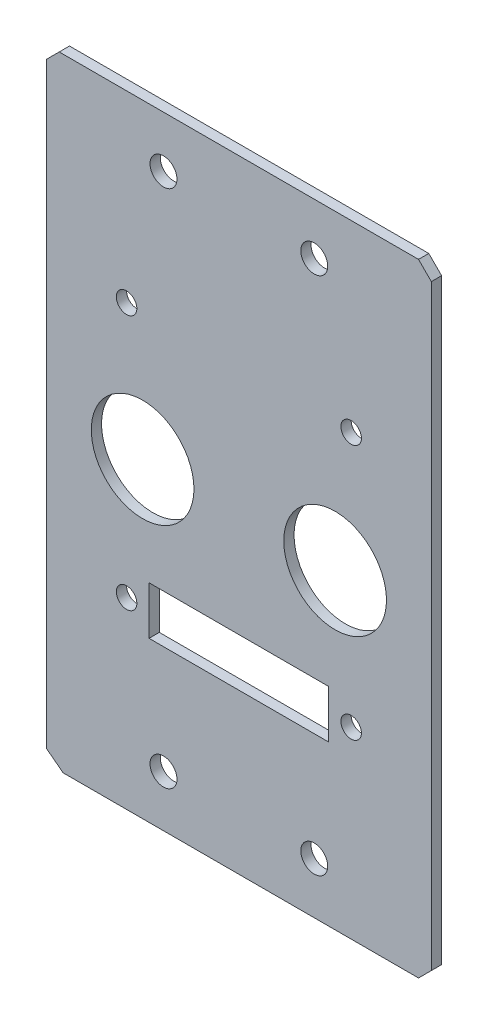
ISO-10303-21;
HEADER;
FILE_DESCRIPTION(('STEP AP214'),'2;1');
FILE_NAME('part.step','',(''),(''),'','','');
FILE_SCHEMA(('AUTOMOTIVE_DESIGN { 1 0 10303 214 1 1 1 1 }'));
ENDSEC;
DATA;
#1=APPLICATION_CONTEXT('core data for automotive mechanical design processes');
#2=APPLICATION_PROTOCOL_DEFINITION('international standard','automotive_design',2000,#1);
#3=PRODUCT_CONTEXT('',#1,'mechanical');
#4=PRODUCT('Part','Part','',(#3));
#5=PRODUCT_RELATED_PRODUCT_CATEGORY('part','',(#4));
#6=PRODUCT_DEFINITION_FORMATION('','',#4);
#7=PRODUCT_DEFINITION_CONTEXT('part definition',#1,'design');
#8=PRODUCT_DEFINITION('design','',#6,#7);
#9=PRODUCT_DEFINITION_SHAPE('','',#8);
#10=(LENGTH_UNIT() NAMED_UNIT(*) SI_UNIT(.MILLI.,.METRE.));
#11=(NAMED_UNIT(*) PLANE_ANGLE_UNIT() SI_UNIT($,.RADIAN.));
#12=(NAMED_UNIT(*) SI_UNIT($,.STERADIAN.) SOLID_ANGLE_UNIT());
#13=UNCERTAINTY_MEASURE_WITH_UNIT(LENGTH_MEASURE(1.E-05),#10,'distance_accuracy_value','');
#14=(GEOMETRIC_REPRESENTATION_CONTEXT(3) GLOBAL_UNCERTAINTY_ASSIGNED_CONTEXT((#13)) GLOBAL_UNIT_ASSIGNED_CONTEXT((#10,
#11,#12)) REPRESENTATION_CONTEXT('',''));
#15=CARTESIAN_POINT('',(0.,0.,0.));
#16=DIRECTION('',(0.,0.,1.));
#17=DIRECTION('',(1.,0.,0.));
#18=AXIS2_PLACEMENT_3D('',#15,#16,#17);
#19=CARTESIAN_POINT('',(1.07552855510562E-13,76.5000000000001,1.6));
#20=DIRECTION('',(0.,0.,-1.));
#21=DIRECTION('',(-1.,0.,0.));
#22=AXIS2_PLACEMENT_3D('',#19,#20,#21);
#23=PLANE('',#22);
#24=CARTESIAN_POINT('',(15.,0.,1.6));
#25=DIRECTION('',(0.,0.,1.));
#26=DIRECTION('',(-1.,0.,0.));
#27=AXIS2_PLACEMENT_3D('',#24,#25,#26);
#28=CIRCLE('',#27,8.);
#29=CARTESIAN_POINT('',(7.,0.,1.6));
#30=VERTEX_POINT('',#29);
#31=EDGE_CURVE('E158',#30,#30,#28,.T.);
#32=ORIENTED_EDGE('',*,*,#31,.F.);
#33=EDGE_LOOP('',(#32));
#34=FACE_BOUND('',#33,.T.);
#35=CARTESIAN_POINT('',(11.75,-40.5,1.6));
#36=DIRECTION('',(0.,0.,1.));
#37=DIRECTION('',(1.,0.,0.));
#38=AXIS2_PLACEMENT_3D('',#35,#36,#37);
#39=CIRCLE('',#38,2.1);
#40=CARTESIAN_POINT('',(13.85,-40.5,1.6));
#41=VERTEX_POINT('',#40);
#42=EDGE_CURVE('E170',#41,#41,#39,.T.);
#43=ORIENTED_EDGE('',*,*,#42,.F.);
#44=EDGE_LOOP('',(#43));
#45=FACE_BOUND('',#44,.T.);
#46=CARTESIAN_POINT('',(17.5,19.9,1.6));
#47=DIRECTION('',(0.,0.,1.));
#48=DIRECTION('',(-1.,0.,0.));
#49=AXIS2_PLACEMENT_3D('',#46,#47,#48);
#50=CIRCLE('',#49,1.6);
#51=CARTESIAN_POINT('',(15.9,19.9,1.6));
#52=VERTEX_POINT('',#51);
#53=EDGE_CURVE('E182',#52,#52,#50,.T.);
#54=ORIENTED_EDGE('',*,*,#53,.F.);
#55=EDGE_LOOP('',(#54));
#56=FACE_BOUND('',#55,.T.);
#57=CARTESIAN_POINT('',(-17.5,-19.9,1.6));
#58=DIRECTION('',(0.,0.,1.));
#59=DIRECTION('',(-1.,0.,0.));
#60=AXIS2_PLACEMENT_3D('',#57,#58,#59);
#61=CIRCLE('',#60,1.6);
#62=CARTESIAN_POINT('',(-19.1,-19.9,1.6));
#63=VERTEX_POINT('',#62);
#64=EDGE_CURVE('E194',#63,#63,#61,.T.);
#65=ORIENTED_EDGE('',*,*,#64,.F.);
#66=EDGE_LOOP('',(#65));
#67=FACE_BOUND('',#66,.T.);
#68=CARTESIAN_POINT('',(-17.5,19.9,1.6));
#69=DIRECTION('',(0.,0.,1.));
#70=DIRECTION('',(1.,0.,0.));
#71=AXIS2_PLACEMENT_3D('',#68,#69,#70);
#72=CIRCLE('',#71,1.6);
#73=CARTESIAN_POINT('',(-15.9,19.9,1.6));
#74=VERTEX_POINT('',#73);
#75=EDGE_CURVE('E206',#74,#74,#72,.T.);
#76=ORIENTED_EDGE('',*,*,#75,.F.);
#77=EDGE_LOOP('',(#76));
#78=FACE_BOUND('',#77,.T.);
#79=DIRECTION('',(-0.707106781186548,-0.707106781186548,0.));
#80=VECTOR('',#79,1.);
#81=CARTESIAN_POINT('',(-30.,46.5,1.6));
#82=LINE('',#81,#80);
#83=CARTESIAN_POINT('',(-28.,48.5,1.6));
#84=VERTEX_POINT('',#83);
#85=CARTESIAN_POINT('',(-30.,46.5,1.6));
#86=VERTEX_POINT('',#85);
#87=EDGE_CURVE('E218',#84,#86,#82,.T.);
#88=ORIENTED_EDGE('',*,*,#87,.T.);
#89=DIRECTION('',(0.,-1.,0.));
#90=VECTOR('',#89,1.);
#91=CARTESIAN_POINT('',(-30.,46.5,1.6));
#92=LINE('',#91,#90);
#93=CARTESIAN_POINT('',(-30.,-46.5,1.6));
#94=VERTEX_POINT('',#93);
#95=EDGE_CURVE('E221',#86,#94,#92,.T.);
#96=ORIENTED_EDGE('',*,*,#95,.T.);
#97=DIRECTION('',(0.793797531827284,-0.608182109622531,0.));
#98=VECTOR('',#97,1.);
#99=CARTESIAN_POINT('',(-30.,-46.5,1.6));
#100=LINE('',#99,#98);
#101=CARTESIAN_POINT('',(-27.3896057800189,-48.5,1.6));
#102=VERTEX_POINT('',#101);
#103=EDGE_CURVE('E224',#94,#102,#100,.T.);
#104=ORIENTED_EDGE('',*,*,#103,.T.);
#105=DIRECTION('',(1.,0.,0.));
#106=VECTOR('',#105,1.);
#107=CARTESIAN_POINT('',(-27.3896057800189,-48.5,1.6));
#108=LINE('',#107,#106);
#109=CARTESIAN_POINT('',(28.,-48.5,1.6));
#110=VERTEX_POINT('',#109);
#111=EDGE_CURVE('E226',#102,#110,#108,.T.);
#112=ORIENTED_EDGE('',*,*,#111,.T.);
#113=DIRECTION('',(0.707106781186548,0.707106781186548,0.));
#114=VECTOR('',#113,1.);
#115=CARTESIAN_POINT('',(28.,-48.5,1.6));
#116=LINE('',#115,#114);
#117=CARTESIAN_POINT('',(30.,-46.5,1.6));
#118=VERTEX_POINT('',#117);
#119=EDGE_CURVE('E228',#110,#118,#116,.T.);
#120=ORIENTED_EDGE('',*,*,#119,.T.);
#121=DIRECTION('',(0.,1.,0.));
#122=VECTOR('',#121,1.);
#123=CARTESIAN_POINT('',(30.,46.5,1.6));
#124=LINE('',#123,#122);
#125=CARTESIAN_POINT('',(30.,46.5,1.6));
#126=VERTEX_POINT('',#125);
#127=EDGE_CURVE('E230',#118,#126,#124,.T.);
#128=ORIENTED_EDGE('',*,*,#127,.T.);
#129=DIRECTION('',(-0.707106781186545,0.70710678118655,0.));
#130=VECTOR('',#129,1.);
#131=CARTESIAN_POINT('',(28.,48.5,1.6));
#132=LINE('',#131,#130);
#133=CARTESIAN_POINT('',(28.,48.5,1.6));
#134=VERTEX_POINT('',#133);
#135=EDGE_CURVE('E232',#126,#134,#132,.T.);
#136=ORIENTED_EDGE('',*,*,#135,.T.);
#137=DIRECTION('',(-1.,0.,0.));
#138=VECTOR('',#137,1.);
#139=CARTESIAN_POINT('',(-28.,48.5,1.6));
#140=LINE('',#139,#138);
#141=EDGE_CURVE('E234',#134,#84,#140,.T.);
#142=ORIENTED_EDGE('',*,*,#141,.T.);
#143=EDGE_LOOP('',(#88,#96,#104,#112,#120,#128,#136,#142));
#144=FACE_BOUND('',#143,.T.);
#145=CARTESIAN_POINT('',(-15.,0.,1.6));
#146=DIRECTION('',(0.,0.,1.));
#147=DIRECTION('',(1.,0.,0.));
#148=AXIS2_PLACEMENT_3D('',#145,#146,#147);
#149=CIRCLE('',#148,8.);
#150=CARTESIAN_POINT('',(-6.99999999999999,0.,1.6));
#151=VERTEX_POINT('',#150);
#152=EDGE_CURVE('E212',#151,#151,#149,.T.);
#153=ORIENTED_EDGE('',*,*,#152,.F.);
#154=EDGE_LOOP('',(#153));
#155=FACE_BOUND('',#154,.T.);
#156=CARTESIAN_POINT('',(-11.75,40.5,1.6));
#157=DIRECTION('',(0.,0.,1.));
#158=DIRECTION('',(1.,0.,0.));
#159=AXIS2_PLACEMENT_3D('',#156,#157,#158);
#160=CIRCLE('',#159,2.1);
#161=CARTESIAN_POINT('',(-9.65,40.5,1.6));
#162=VERTEX_POINT('',#161);
#163=EDGE_CURVE('E200',#162,#162,#160,.T.);
#164=ORIENTED_EDGE('',*,*,#163,.F.);
#165=EDGE_LOOP('',(#164));
#166=FACE_BOUND('',#165,.T.);
#167=CARTESIAN_POINT('',(-11.75,-40.5,1.6));
#168=DIRECTION('',(0.,0.,1.));
#169=DIRECTION('',(-1.,0.,0.));
#170=AXIS2_PLACEMENT_3D('',#167,#168,#169);
#171=CIRCLE('',#170,2.1);
#172=CARTESIAN_POINT('',(-13.85,-40.5,1.6));
#173=VERTEX_POINT('',#172);
#174=EDGE_CURVE('E188',#173,#173,#171,.T.);
#175=ORIENTED_EDGE('',*,*,#174,.F.);
#176=EDGE_LOOP('',(#175));
#177=FACE_BOUND('',#176,.T.);
#178=CARTESIAN_POINT('',(11.75,40.5,1.6));
#179=DIRECTION('',(0.,0.,1.));
#180=DIRECTION('',(-1.,0.,0.));
#181=AXIS2_PLACEMENT_3D('',#178,#179,#180);
#182=CIRCLE('',#181,2.1);
#183=CARTESIAN_POINT('',(9.65000000000003,40.5,1.6));
#184=VERTEX_POINT('',#183);
#185=EDGE_CURVE('E176',#184,#184,#182,.T.);
#186=ORIENTED_EDGE('',*,*,#185,.F.);
#187=EDGE_LOOP('',(#186));
#188=FACE_BOUND('',#187,.T.);
#189=CARTESIAN_POINT('',(17.5,-19.9,1.6));
#190=DIRECTION('',(0.,0.,1.));
#191=DIRECTION('',(1.,0.,0.));
#192=AXIS2_PLACEMENT_3D('',#189,#190,#191);
#193=CIRCLE('',#192,1.6);
#194=CARTESIAN_POINT('',(19.1,-19.9,1.6));
#195=VERTEX_POINT('',#194);
#196=EDGE_CURVE('E164',#195,#195,#193,.T.);
#197=ORIENTED_EDGE('',*,*,#196,.F.);
#198=EDGE_LOOP('',(#197));
#199=FACE_BOUND('',#198,.T.);
#200=DIRECTION('',(0.,-1.,0.));
#201=VECTOR('',#200,1.);
#202=CARTESIAN_POINT('',(-14.,-16.15,1.6));
#203=LINE('',#202,#201);
#204=CARTESIAN_POINT('',(-14.,-16.15,1.6));
#205=VERTEX_POINT('',#204);
#206=CARTESIAN_POINT('',(-14.,-23.65,1.6));
#207=VERTEX_POINT('',#206);
#208=EDGE_CURVE('E122',#205,#207,#203,.T.);
#209=ORIENTED_EDGE('',*,*,#208,.F.);
#210=DIRECTION('',(-1.,0.,0.));
#211=VECTOR('',#210,1.);
#212=CARTESIAN_POINT('',(-14.,-16.15,1.6));
#213=LINE('',#212,#211);
#214=CARTESIAN_POINT('',(14.,-16.15,1.6));
#215=VERTEX_POINT('',#214);
#216=EDGE_CURVE('E144',#215,#205,#213,.T.);
#217=ORIENTED_EDGE('',*,*,#216,.F.);
#218=DIRECTION('',(0.,1.,0.));
#219=VECTOR('',#218,1.);
#220=CARTESIAN_POINT('',(14.,-16.15,1.6));
#221=LINE('',#220,#219);
#222=CARTESIAN_POINT('',(14.,-23.65,1.6));
#223=VERTEX_POINT('',#222);
#224=EDGE_CURVE('E142',#223,#215,#221,.T.);
#225=ORIENTED_EDGE('',*,*,#224,.F.);
#226=DIRECTION('',(1.,0.,0.));
#227=VECTOR('',#226,1.);
#228=CARTESIAN_POINT('',(-14.,-23.65,1.6));
#229=LINE('',#228,#227);
#230=EDGE_CURVE('E130',#207,#223,#229,.T.);
#231=ORIENTED_EDGE('',*,*,#230,.F.);
#232=EDGE_LOOP('',(#209,#217,#225,#231));
#233=FACE_BOUND('',#232,.T.);
#234=ADVANCED_FACE('F33',(#34,#45,#56,#67,#78,#144,#155,#166,#177,#188,#199,#233),#23,.F.);
#235=CARTESIAN_POINT('',(1.07552855510562E-13,76.5000000000001,0.));
#236=DIRECTION('',(0.,0.,-1.));
#237=DIRECTION('',(-1.,0.,0.));
#238=AXIS2_PLACEMENT_3D('',#235,#236,#237);
#239=PLANE('',#238);
#240=CARTESIAN_POINT('',(15.,0.,0.));
#241=DIRECTION('',(0.,0.,1.));
#242=DIRECTION('',(-1.,0.,0.));
#243=AXIS2_PLACEMENT_3D('',#240,#241,#242);
#244=CIRCLE('',#243,8.);
#245=CARTESIAN_POINT('',(7.,0.,0.));
#246=VERTEX_POINT('',#245);
#247=EDGE_CURVE('E138',#246,#246,#244,.T.);
#248=ORIENTED_EDGE('',*,*,#247,.T.);
#249=EDGE_LOOP('',(#248));
#250=FACE_BOUND('',#249,.T.);
#251=CARTESIAN_POINT('',(11.75,-40.5,0.));
#252=DIRECTION('',(0.,0.,1.));
#253=DIRECTION('',(1.,0.,0.));
#254=AXIS2_PLACEMENT_3D('',#251,#252,#253);
#255=CIRCLE('',#254,2.1);
#256=CARTESIAN_POINT('',(13.85,-40.5,0.));
#257=VERTEX_POINT('',#256);
#258=EDGE_CURVE('E167',#257,#257,#255,.T.);
#259=ORIENTED_EDGE('',*,*,#258,.T.);
#260=EDGE_LOOP('',(#259));
#261=FACE_BOUND('',#260,.T.);
#262=CARTESIAN_POINT('',(17.5,19.9,0.));
#263=DIRECTION('',(0.,0.,1.));
#264=DIRECTION('',(-1.,0.,0.));
#265=AXIS2_PLACEMENT_3D('',#262,#263,#264);
#266=CIRCLE('',#265,1.6);
#267=CARTESIAN_POINT('',(15.9,19.9,0.));
#268=VERTEX_POINT('',#267);
#269=EDGE_CURVE('E179',#268,#268,#266,.T.);
#270=ORIENTED_EDGE('',*,*,#269,.T.);
#271=EDGE_LOOP('',(#270));
#272=FACE_BOUND('',#271,.T.);
#273=CARTESIAN_POINT('',(-17.5,-19.9,0.));
#274=DIRECTION('',(0.,0.,1.));
#275=DIRECTION('',(-1.,0.,0.));
#276=AXIS2_PLACEMENT_3D('',#273,#274,#275);
#277=CIRCLE('',#276,1.6);
#278=CARTESIAN_POINT('',(-19.1,-19.9,0.));
#279=VERTEX_POINT('',#278);
#280=EDGE_CURVE('E191',#279,#279,#277,.T.);
#281=ORIENTED_EDGE('',*,*,#280,.T.);
#282=EDGE_LOOP('',(#281));
#283=FACE_BOUND('',#282,.T.);
#284=CARTESIAN_POINT('',(-17.5,19.9,0.));
#285=DIRECTION('',(0.,0.,1.));
#286=DIRECTION('',(1.,0.,0.));
#287=AXIS2_PLACEMENT_3D('',#284,#285,#286);
#288=CIRCLE('',#287,1.6);
#289=CARTESIAN_POINT('',(-15.9,19.9,0.));
#290=VERTEX_POINT('',#289);
#291=EDGE_CURVE('E203',#290,#290,#288,.T.);
#292=ORIENTED_EDGE('',*,*,#291,.T.);
#293=EDGE_LOOP('',(#292));
#294=FACE_BOUND('',#293,.T.);
#295=DIRECTION('',(-0.707106781186548,-0.707106781186548,0.));
#296=VECTOR('',#295,1.);
#297=CARTESIAN_POINT('',(-30.,46.5,0.));
#298=LINE('',#297,#296);
#299=CARTESIAN_POINT('',(-28.,48.5,0.));
#300=VERTEX_POINT('',#299);
#301=CARTESIAN_POINT('',(-30.,46.5,0.));
#302=VERTEX_POINT('',#301);
#303=EDGE_CURVE('E215',#300,#302,#298,.T.);
#304=ORIENTED_EDGE('',*,*,#303,.F.);
#305=DIRECTION('',(-1.,0.,0.));
#306=VECTOR('',#305,1.);
#307=CARTESIAN_POINT('',(-28.,48.5,0.));
#308=LINE('',#307,#306);
#309=CARTESIAN_POINT('',(28.,48.5,0.));
#310=VERTEX_POINT('',#309);
#311=EDGE_CURVE('E222',#310,#300,#308,.T.);
#312=ORIENTED_EDGE('',*,*,#311,.F.);
#313=DIRECTION('',(-0.707106781186545,0.70710678118655,0.));
#314=VECTOR('',#313,1.);
#315=CARTESIAN_POINT('',(28.,48.5,0.));
#316=LINE('',#315,#314);
#317=CARTESIAN_POINT('',(30.,46.5,0.));
#318=VERTEX_POINT('',#317);
#319=EDGE_CURVE('E249',#318,#310,#316,.T.);
#320=ORIENTED_EDGE('',*,*,#319,.F.);
#321=DIRECTION('',(0.,1.,0.));
#322=VECTOR('',#321,1.);
#323=CARTESIAN_POINT('',(30.,46.5,0.));
#324=LINE('',#323,#322);
#325=CARTESIAN_POINT('',(30.,-46.5,0.));
#326=VERTEX_POINT('',#325);
#327=EDGE_CURVE('E247',#326,#318,#324,.T.);
#328=ORIENTED_EDGE('',*,*,#327,.F.);
#329=DIRECTION('',(0.707106781186548,0.707106781186548,0.));
#330=VECTOR('',#329,1.);
#331=CARTESIAN_POINT('',(28.,-48.5,0.));
#332=LINE('',#331,#330);
#333=CARTESIAN_POINT('',(28.,-48.5,0.));
#334=VERTEX_POINT('',#333);
#335=EDGE_CURVE('E245',#334,#326,#332,.T.);
#336=ORIENTED_EDGE('',*,*,#335,.F.);
#337=DIRECTION('',(1.,0.,0.));
#338=VECTOR('',#337,1.);
#339=CARTESIAN_POINT('',(-27.3896057800189,-48.5,0.));
#340=LINE('',#339,#338);
#341=CARTESIAN_POINT('',(-27.3896057800189,-48.5,0.));
#342=VERTEX_POINT('',#341);
#343=EDGE_CURVE('E243',#342,#334,#340,.T.);
#344=ORIENTED_EDGE('',*,*,#343,.F.);
#345=DIRECTION('',(0.793797531827284,-0.608182109622531,0.));
#346=VECTOR('',#345,1.);
#347=CARTESIAN_POINT('',(-30.,-46.5,0.));
#348=LINE('',#347,#346);
#349=CARTESIAN_POINT('',(-30.,-46.5,0.));
#350=VERTEX_POINT('',#349);
#351=EDGE_CURVE('E241',#350,#342,#348,.T.);
#352=ORIENTED_EDGE('',*,*,#351,.F.);
#353=DIRECTION('',(0.,-1.,0.));
#354=VECTOR('',#353,1.);
#355=CARTESIAN_POINT('',(-30.,46.5,0.));
#356=LINE('',#355,#354);
#357=EDGE_CURVE('E239',#302,#350,#356,.T.);
#358=ORIENTED_EDGE('',*,*,#357,.F.);
#359=EDGE_LOOP('',(#304,#312,#320,#328,#336,#344,#352,#358));
#360=FACE_BOUND('',#359,.T.);
#361=CARTESIAN_POINT('',(-15.,0.,0.));
#362=DIRECTION('',(0.,0.,1.));
#363=DIRECTION('',(1.,0.,0.));
#364=AXIS2_PLACEMENT_3D('',#361,#362,#363);
#365=CIRCLE('',#364,8.);
#366=CARTESIAN_POINT('',(-6.99999999999999,0.,0.));
#367=VERTEX_POINT('',#366);
#368=EDGE_CURVE('E209',#367,#367,#365,.T.);
#369=ORIENTED_EDGE('',*,*,#368,.T.);
#370=EDGE_LOOP('',(#369));
#371=FACE_BOUND('',#370,.T.);
#372=CARTESIAN_POINT('',(-11.75,40.5,0.));
#373=DIRECTION('',(0.,0.,1.));
#374=DIRECTION('',(1.,0.,0.));
#375=AXIS2_PLACEMENT_3D('',#372,#373,#374);
#376=CIRCLE('',#375,2.1);
#377=CARTESIAN_POINT('',(-9.65,40.5,0.));
#378=VERTEX_POINT('',#377);
#379=EDGE_CURVE('E197',#378,#378,#376,.T.);
#380=ORIENTED_EDGE('',*,*,#379,.T.);
#381=EDGE_LOOP('',(#380));
#382=FACE_BOUND('',#381,.T.);
#383=CARTESIAN_POINT('',(-11.75,-40.5,0.));
#384=DIRECTION('',(0.,0.,1.));
#385=DIRECTION('',(-1.,0.,0.));
#386=AXIS2_PLACEMENT_3D('',#383,#384,#385);
#387=CIRCLE('',#386,2.1);
#388=CARTESIAN_POINT('',(-13.85,-40.5,0.));
#389=VERTEX_POINT('',#388);
#390=EDGE_CURVE('E185',#389,#389,#387,.T.);
#391=ORIENTED_EDGE('',*,*,#390,.T.);
#392=EDGE_LOOP('',(#391));
#393=FACE_BOUND('',#392,.T.);
#394=CARTESIAN_POINT('',(11.75,40.5,0.));
#395=DIRECTION('',(0.,0.,1.));
#396=DIRECTION('',(-1.,0.,0.));
#397=AXIS2_PLACEMENT_3D('',#394,#395,#396);
#398=CIRCLE('',#397,2.1);
#399=CARTESIAN_POINT('',(9.65000000000003,40.5,0.));
#400=VERTEX_POINT('',#399);
#401=EDGE_CURVE('E173',#400,#400,#398,.T.);
#402=ORIENTED_EDGE('',*,*,#401,.T.);
#403=EDGE_LOOP('',(#402));
#404=FACE_BOUND('',#403,.T.);
#405=CARTESIAN_POINT('',(17.5,-19.9,0.));
#406=DIRECTION('',(0.,0.,1.));
#407=DIRECTION('',(1.,0.,0.));
#408=AXIS2_PLACEMENT_3D('',#405,#406,#407);
#409=CIRCLE('',#408,1.6);
#410=CARTESIAN_POINT('',(19.1,-19.9,0.));
#411=VERTEX_POINT('',#410);
#412=EDGE_CURVE('E161',#411,#411,#409,.T.);
#413=ORIENTED_EDGE('',*,*,#412,.T.);
#414=EDGE_LOOP('',(#413));
#415=FACE_BOUND('',#414,.T.);
#416=DIRECTION('',(-1.,0.,0.));
#417=VECTOR('',#416,1.);
#418=CARTESIAN_POINT('',(-14.,-16.15,0.));
#419=LINE('',#418,#417);
#420=CARTESIAN_POINT('',(14.,-16.15,0.));
#421=VERTEX_POINT('',#420);
#422=CARTESIAN_POINT('',(-14.,-16.15,0.));
#423=VERTEX_POINT('',#422);
#424=EDGE_CURVE('E131',#421,#423,#419,.T.);
#425=ORIENTED_EDGE('',*,*,#424,.T.);
#426=DIRECTION('',(0.,-1.,0.));
#427=VECTOR('',#426,1.);
#428=CARTESIAN_POINT('',(-14.,-16.15,0.));
#429=LINE('',#428,#427);
#430=CARTESIAN_POINT('',(-14.,-23.65,0.));
#431=VERTEX_POINT('',#430);
#432=EDGE_CURVE('E56',#423,#431,#429,.T.);
#433=ORIENTED_EDGE('',*,*,#432,.T.);
#434=DIRECTION('',(1.,0.,0.));
#435=VECTOR('',#434,1.);
#436=CARTESIAN_POINT('',(-14.,-23.65,0.));
#437=LINE('',#436,#435);
#438=CARTESIAN_POINT('',(14.,-23.65,0.));
#439=VERTEX_POINT('',#438);
#440=EDGE_CURVE('E137',#431,#439,#437,.T.);
#441=ORIENTED_EDGE('',*,*,#440,.T.);
#442=DIRECTION('',(0.,1.,0.));
#443=VECTOR('',#442,1.);
#444=CARTESIAN_POINT('',(14.,-16.15,0.));
#445=LINE('',#444,#443);
#446=EDGE_CURVE('E150',#439,#421,#445,.T.);
#447=ORIENTED_EDGE('',*,*,#446,.T.);
#448=EDGE_LOOP('',(#425,#433,#441,#447));
#449=FACE_BOUND('',#448,.T.);
#450=ADVANCED_FACE('F279',(#250,#261,#272,#283,#294,#360,#371,#382,#393,#404,#415,#449),#239,.T.);
#451=CARTESIAN_POINT('',(-30.,46.5,1.6));
#452=DIRECTION('',(0.707106781186548,-0.707106781186548,0.));
#453=DIRECTION('',(0.707106781186548,0.707106781186548,0.));
#454=AXIS2_PLACEMENT_3D('',#451,#452,#453);
#455=PLANE('',#454);
#456=ORIENTED_EDGE('',*,*,#303,.T.);
#457=DIRECTION('',(0.,0.,-1.));
#458=VECTOR('',#457,1.);
#459=CARTESIAN_POINT('',(-30.,46.5,1.6));
#460=LINE('',#459,#458);
#461=EDGE_CURVE('E11',#86,#302,#460,.T.);
#462=ORIENTED_EDGE('',*,*,#461,.F.);
#463=ORIENTED_EDGE('',*,*,#87,.F.);
#464=DIRECTION('',(0.,0.,-1.));
#465=VECTOR('',#464,1.);
#466=CARTESIAN_POINT('',(-28.,48.5,1.6));
#467=LINE('',#466,#465);
#468=EDGE_CURVE('E236',#84,#300,#467,.T.);
#469=ORIENTED_EDGE('',*,*,#468,.T.);
#470=EDGE_LOOP('',(#456,#462,#463,#469));
#471=FACE_BOUND('',#470,.T.);
#472=ADVANCED_FACE('F35',(#471),#455,.F.);
#473=CARTESIAN_POINT('',(-30.,46.5,1.6));
#474=DIRECTION('',(1.,0.,0.));
#475=DIRECTION('',(0.,1.,0.));
#476=AXIS2_PLACEMENT_3D('',#473,#474,#475);
#477=PLANE('',#476);
#478=ORIENTED_EDGE('',*,*,#357,.T.);
#479=DIRECTION('',(0.,0.,-1.));
#480=VECTOR('',#479,1.);
#481=CARTESIAN_POINT('',(-30.,-46.5,1.6));
#482=LINE('',#481,#480);
#483=EDGE_CURVE('E41',#94,#350,#482,.T.);
#484=ORIENTED_EDGE('',*,*,#483,.F.);
#485=ORIENTED_EDGE('',*,*,#95,.F.);
#486=ORIENTED_EDGE('',*,*,#461,.T.);
#487=EDGE_LOOP('',(#478,#484,#485,#486));
#488=FACE_BOUND('',#487,.T.);
#489=ADVANCED_FACE('F297',(#488),#477,.F.);
#490=CARTESIAN_POINT('',(-30.,-46.5,1.6));
#491=DIRECTION('',(0.608182109622531,0.793797531827284,0.));
#492=DIRECTION('',(-0.793797531827284,0.608182109622531,0.));
#493=AXIS2_PLACEMENT_3D('',#490,#491,#492);
#494=PLANE('',#493);
#495=ORIENTED_EDGE('',*,*,#351,.T.);
#496=DIRECTION('',(0.,0.,-1.));
#497=VECTOR('',#496,1.);
#498=CARTESIAN_POINT('',(-27.3896057800189,-48.5,1.6));
#499=LINE('',#498,#497);
#500=EDGE_CURVE('E266',#102,#342,#499,.T.);
#501=ORIENTED_EDGE('',*,*,#500,.F.);
#502=ORIENTED_EDGE('',*,*,#103,.F.);
#503=ORIENTED_EDGE('',*,*,#483,.T.);
#504=EDGE_LOOP('',(#495,#501,#502,#503));
#505=FACE_BOUND('',#504,.T.);
#506=ADVANCED_FACE('F273',(#505),#494,.F.);
#507=CARTESIAN_POINT('',(-27.3896057800189,-48.5,1.6));
#508=DIRECTION('',(0.,1.,0.));
#509=DIRECTION('',(-1.,0.,0.));
#510=AXIS2_PLACEMENT_3D('',#507,#508,#509);
#511=PLANE('',#510);
#512=ORIENTED_EDGE('',*,*,#343,.T.);
#513=DIRECTION('',(0.,0.,-1.));
#514=VECTOR('',#513,1.);
#515=CARTESIAN_POINT('',(28.,-48.5,1.6));
#516=LINE('',#515,#514);
#517=EDGE_CURVE('E263',#110,#334,#516,.T.);
#518=ORIENTED_EDGE('',*,*,#517,.F.);
#519=ORIENTED_EDGE('',*,*,#111,.F.);
#520=ORIENTED_EDGE('',*,*,#500,.T.);
#521=EDGE_LOOP('',(#512,#518,#519,#520));
#522=FACE_BOUND('',#521,.T.);
#523=ADVANCED_FACE('F285',(#522),#511,.F.);
#524=CARTESIAN_POINT('',(28.,-48.5,1.6));
#525=DIRECTION('',(-0.707106781186548,0.707106781186548,0.));
#526=DIRECTION('',(-0.707106781186548,-0.707106781186548,0.));
#527=AXIS2_PLACEMENT_3D('',#524,#525,#526);
#528=PLANE('',#527);
#529=ORIENTED_EDGE('',*,*,#335,.T.);
#530=DIRECTION('',(0.,0.,-1.));
#531=VECTOR('',#530,1.);
#532=CARTESIAN_POINT('',(30.,-46.5,1.6));
#533=LINE('',#532,#531);
#534=EDGE_CURVE('E260',#118,#326,#533,.T.);
#535=ORIENTED_EDGE('',*,*,#534,.F.);
#536=ORIENTED_EDGE('',*,*,#119,.F.);
#537=ORIENTED_EDGE('',*,*,#517,.T.);
#538=EDGE_LOOP('',(#529,#535,#536,#537));
#539=FACE_BOUND('',#538,.T.);
#540=ADVANCED_FACE('F289',(#539),#528,.F.);
#541=CARTESIAN_POINT('',(30.,46.5,1.6));
#542=DIRECTION('',(-1.,0.,0.));
#543=DIRECTION('',(0.,-1.,0.));
#544=AXIS2_PLACEMENT_3D('',#541,#542,#543);
#545=PLANE('',#544);
#546=ORIENTED_EDGE('',*,*,#327,.T.);
#547=DIRECTION('',(0.,0.,-1.));
#548=VECTOR('',#547,1.);
#549=CARTESIAN_POINT('',(30.,46.5,1.6));
#550=LINE('',#549,#548);
#551=EDGE_CURVE('E257',#126,#318,#550,.T.);
#552=ORIENTED_EDGE('',*,*,#551,.F.);
#553=ORIENTED_EDGE('',*,*,#127,.F.);
#554=ORIENTED_EDGE('',*,*,#534,.T.);
#555=EDGE_LOOP('',(#546,#552,#553,#554));
#556=FACE_BOUND('',#555,.T.);
#557=ADVANCED_FACE('F310',(#556),#545,.F.);
#558=CARTESIAN_POINT('',(28.,48.5,1.6));
#559=DIRECTION('',(-0.70710678118655,-0.707106781186545,0.));
#560=DIRECTION('',(0.707106781186545,-0.70710678118655,0.));
#561=AXIS2_PLACEMENT_3D('',#558,#559,#560);
#562=PLANE('',#561);
#563=ORIENTED_EDGE('',*,*,#319,.T.);
#564=DIRECTION('',(0.,0.,-1.));
#565=VECTOR('',#564,1.);
#566=CARTESIAN_POINT('',(28.,48.5,1.6));
#567=LINE('',#566,#565);
#568=EDGE_CURVE('E254',#134,#310,#567,.T.);
#569=ORIENTED_EDGE('',*,*,#568,.F.);
#570=ORIENTED_EDGE('',*,*,#135,.F.);
#571=ORIENTED_EDGE('',*,*,#551,.T.);
#572=EDGE_LOOP('',(#563,#569,#570,#571));
#573=FACE_BOUND('',#572,.T.);
#574=ADVANCED_FACE('F308',(#573),#562,.F.);
#575=CARTESIAN_POINT('',(-28.,48.5,1.6));
#576=DIRECTION('',(0.,-1.,0.));
#577=DIRECTION('',(1.,0.,0.));
#578=AXIS2_PLACEMENT_3D('',#575,#576,#577);
#579=PLANE('',#578);
#580=ORIENTED_EDGE('',*,*,#311,.T.);
#581=ORIENTED_EDGE('',*,*,#468,.F.);
#582=ORIENTED_EDGE('',*,*,#141,.F.);
#583=ORIENTED_EDGE('',*,*,#568,.T.);
#584=EDGE_LOOP('',(#580,#581,#582,#583));
#585=FACE_BOUND('',#584,.T.);
#586=ADVANCED_FACE('F303',(#585),#579,.F.);
#587=CARTESIAN_POINT('',(-15.,0.,1.6));
#588=DIRECTION('',(0.,0.,-1.));
#589=DIRECTION('',(-1.,0.,0.));
#590=AXIS2_PLACEMENT_3D('',#587,#588,#589);
#591=CYLINDRICAL_SURFACE('',#590,8.);
#592=ORIENTED_EDGE('',*,*,#152,.T.);
#593=EDGE_LOOP('',(#592));
#594=FACE_BOUND('',#593,.T.);
#595=ORIENTED_EDGE('',*,*,#368,.F.);
#596=EDGE_LOOP('',(#595));
#597=FACE_BOUND('',#596,.T.);
#598=ADVANCED_FACE('F330',(#594,#597),#591,.F.);
#599=CARTESIAN_POINT('',(-17.5,19.9,1.6));
#600=DIRECTION('',(0.,0.,-1.));
#601=DIRECTION('',(-1.,0.,0.));
#602=AXIS2_PLACEMENT_3D('',#599,#600,#601);
#603=CYLINDRICAL_SURFACE('',#602,1.6);
#604=ORIENTED_EDGE('',*,*,#75,.T.);
#605=EDGE_LOOP('',(#604));
#606=FACE_BOUND('',#605,.T.);
#607=ORIENTED_EDGE('',*,*,#291,.F.);
#608=EDGE_LOOP('',(#607));
#609=FACE_BOUND('',#608,.T.);
#610=ADVANCED_FACE('F337',(#606,#609),#603,.F.);
#611=CARTESIAN_POINT('',(-11.75,40.5,1.6));
#612=DIRECTION('',(0.,0.,-1.));
#613=DIRECTION('',(-1.,0.,0.));
#614=AXIS2_PLACEMENT_3D('',#611,#612,#613);
#615=CYLINDRICAL_SURFACE('',#614,2.1);
#616=ORIENTED_EDGE('',*,*,#163,.T.);
#617=EDGE_LOOP('',(#616));
#618=FACE_BOUND('',#617,.T.);
#619=ORIENTED_EDGE('',*,*,#379,.F.);
#620=EDGE_LOOP('',(#619));
#621=FACE_BOUND('',#620,.T.);
#622=ADVANCED_FACE('F342',(#618,#621),#615,.F.);
#623=CARTESIAN_POINT('',(-17.5,-19.9,1.6));
#624=DIRECTION('',(0.,0.,-1.));
#625=DIRECTION('',(-1.,0.,0.));
#626=AXIS2_PLACEMENT_3D('',#623,#624,#625);
#627=CYLINDRICAL_SURFACE('',#626,1.6);
#628=ORIENTED_EDGE('',*,*,#64,.T.);
#629=EDGE_LOOP('',(#628));
#630=FACE_BOUND('',#629,.T.);
#631=ORIENTED_EDGE('',*,*,#280,.F.);
#632=EDGE_LOOP('',(#631));
#633=FACE_BOUND('',#632,.T.);
#634=ADVANCED_FACE('F394',(#630,#633),#627,.F.);
#635=CARTESIAN_POINT('',(-11.75,-40.5,1.6));
#636=DIRECTION('',(0.,0.,-1.));
#637=DIRECTION('',(-1.,0.,0.));
#638=AXIS2_PLACEMENT_3D('',#635,#636,#637);
#639=CYLINDRICAL_SURFACE('',#638,2.1);
#640=ORIENTED_EDGE('',*,*,#174,.T.);
#641=EDGE_LOOP('',(#640));
#642=FACE_BOUND('',#641,.T.);
#643=ORIENTED_EDGE('',*,*,#390,.F.);
#644=EDGE_LOOP('',(#643));
#645=FACE_BOUND('',#644,.T.);
#646=ADVANCED_FACE('F390',(#642,#645),#639,.F.);
#647=CARTESIAN_POINT('',(17.5,19.9,1.6));
#648=DIRECTION('',(0.,0.,-1.));
#649=DIRECTION('',(-1.,0.,0.));
#650=AXIS2_PLACEMENT_3D('',#647,#648,#649);
#651=CYLINDRICAL_SURFACE('',#650,1.6);
#652=ORIENTED_EDGE('',*,*,#53,.T.);
#653=EDGE_LOOP('',(#652));
#654=FACE_BOUND('',#653,.T.);
#655=ORIENTED_EDGE('',*,*,#269,.F.);
#656=EDGE_LOOP('',(#655));
#657=FACE_BOUND('',#656,.T.);
#658=ADVANCED_FACE('F386',(#654,#657),#651,.F.);
#659=CARTESIAN_POINT('',(11.75,40.5,1.6));
#660=DIRECTION('',(0.,0.,-1.));
#661=DIRECTION('',(-1.,0.,0.));
#662=AXIS2_PLACEMENT_3D('',#659,#660,#661);
#663=CYLINDRICAL_SURFACE('',#662,2.1);
#664=ORIENTED_EDGE('',*,*,#185,.T.);
#665=EDGE_LOOP('',(#664));
#666=FACE_BOUND('',#665,.T.);
#667=ORIENTED_EDGE('',*,*,#401,.F.);
#668=EDGE_LOOP('',(#667));
#669=FACE_BOUND('',#668,.T.);
#670=ADVANCED_FACE('F382',(#666,#669),#663,.F.);
#671=CARTESIAN_POINT('',(11.75,-40.5,1.6));
#672=DIRECTION('',(0.,0.,-1.));
#673=DIRECTION('',(-1.,0.,0.));
#674=AXIS2_PLACEMENT_3D('',#671,#672,#673);
#675=CYLINDRICAL_SURFACE('',#674,2.1);
#676=ORIENTED_EDGE('',*,*,#42,.T.);
#677=EDGE_LOOP('',(#676));
#678=FACE_BOUND('',#677,.T.);
#679=ORIENTED_EDGE('',*,*,#258,.F.);
#680=EDGE_LOOP('',(#679));
#681=FACE_BOUND('',#680,.T.);
#682=ADVANCED_FACE('F378',(#678,#681),#675,.F.);
#683=CARTESIAN_POINT('',(17.5,-19.9,1.6));
#684=DIRECTION('',(0.,0.,-1.));
#685=DIRECTION('',(-1.,0.,0.));
#686=AXIS2_PLACEMENT_3D('',#683,#684,#685);
#687=CYLINDRICAL_SURFACE('',#686,1.6);
#688=ORIENTED_EDGE('',*,*,#196,.T.);
#689=EDGE_LOOP('',(#688));
#690=FACE_BOUND('',#689,.T.);
#691=ORIENTED_EDGE('',*,*,#412,.F.);
#692=EDGE_LOOP('',(#691));
#693=FACE_BOUND('',#692,.T.);
#694=ADVANCED_FACE('F374',(#690,#693),#687,.F.);
#695=CARTESIAN_POINT('',(15.,0.,1.6));
#696=DIRECTION('',(0.,0.,-1.));
#697=DIRECTION('',(-1.,0.,0.));
#698=AXIS2_PLACEMENT_3D('',#695,#696,#697);
#699=CYLINDRICAL_SURFACE('',#698,8.);
#700=ORIENTED_EDGE('',*,*,#31,.T.);
#701=EDGE_LOOP('',(#700));
#702=FACE_BOUND('',#701,.T.);
#703=ORIENTED_EDGE('',*,*,#247,.F.);
#704=EDGE_LOOP('',(#703));
#705=FACE_BOUND('',#704,.T.);
#706=ADVANCED_FACE('F371',(#702,#705),#699,.F.);
#707=CARTESIAN_POINT('',(-14.,-16.15,1.6));
#708=DIRECTION('',(1.,0.,0.));
#709=DIRECTION('',(0.,1.,0.));
#710=AXIS2_PLACEMENT_3D('',#707,#708,#709);
#711=PLANE('',#710);
#712=ORIENTED_EDGE('',*,*,#432,.F.);
#713=DIRECTION('',(0.,0.,-1.));
#714=VECTOR('',#713,1.);
#715=CARTESIAN_POINT('',(-14.,-16.15,1.6));
#716=LINE('',#715,#714);
#717=EDGE_CURVE('E126',#205,#423,#716,.T.);
#718=ORIENTED_EDGE('',*,*,#717,.F.);
#719=ORIENTED_EDGE('',*,*,#208,.T.);
#720=DIRECTION('',(0.,0.,-1.));
#721=VECTOR('',#720,1.);
#722=CARTESIAN_POINT('',(-14.,-23.65,1.6));
#723=LINE('',#722,#721);
#724=EDGE_CURVE('E125',#207,#431,#723,.T.);
#725=ORIENTED_EDGE('',*,*,#724,.T.);
#726=EDGE_LOOP('',(#712,#718,#719,#725));
#727=FACE_BOUND('',#726,.T.);
#728=ADVANCED_FACE('F124',(#727),#711,.T.);
#729=CARTESIAN_POINT('',(-14.,-23.65,1.6));
#730=DIRECTION('',(0.,1.,0.));
#731=DIRECTION('',(-1.,0.,0.));
#732=AXIS2_PLACEMENT_3D('',#729,#730,#731);
#733=PLANE('',#732);
#734=ORIENTED_EDGE('',*,*,#440,.F.);
#735=ORIENTED_EDGE('',*,*,#724,.F.);
#736=ORIENTED_EDGE('',*,*,#230,.T.);
#737=DIRECTION('',(0.,0.,-1.));
#738=VECTOR('',#737,1.);
#739=CARTESIAN_POINT('',(14.,-23.65,1.6));
#740=LINE('',#739,#738);
#741=EDGE_CURVE('E139',#223,#439,#740,.T.);
#742=ORIENTED_EDGE('',*,*,#741,.T.);
#743=EDGE_LOOP('',(#734,#735,#736,#742));
#744=FACE_BOUND('',#743,.T.);
#745=ADVANCED_FACE('F134',(#744),#733,.T.);
#746=CARTESIAN_POINT('',(14.,-16.15,1.6));
#747=DIRECTION('',(-1.,0.,0.));
#748=DIRECTION('',(0.,-1.,0.));
#749=AXIS2_PLACEMENT_3D('',#746,#747,#748);
#750=PLANE('',#749);
#751=ORIENTED_EDGE('',*,*,#446,.F.);
#752=ORIENTED_EDGE('',*,*,#741,.F.);
#753=ORIENTED_EDGE('',*,*,#224,.T.);
#754=DIRECTION('',(0.,0.,-1.));
#755=VECTOR('',#754,1.);
#756=CARTESIAN_POINT('',(14.,-16.15,1.6));
#757=LINE('',#756,#755);
#758=EDGE_CURVE('E48',#215,#421,#757,.T.);
#759=ORIENTED_EDGE('',*,*,#758,.T.);
#760=EDGE_LOOP('',(#751,#752,#753,#759));
#761=FACE_BOUND('',#760,.T.);
#762=ADVANCED_FACE('F359',(#761),#750,.T.);
#763=CARTESIAN_POINT('',(-14.,-16.15,1.6));
#764=DIRECTION('',(0.,-1.,0.));
#765=DIRECTION('',(0.,0.,-1.));
#766=AXIS2_PLACEMENT_3D('',#763,#764,#765);
#767=PLANE('',#766);
#768=ORIENTED_EDGE('',*,*,#424,.F.);
#769=ORIENTED_EDGE('',*,*,#758,.F.);
#770=ORIENTED_EDGE('',*,*,#216,.T.);
#771=ORIENTED_EDGE('',*,*,#717,.T.);
#772=EDGE_LOOP('',(#768,#769,#770,#771));
#773=FACE_BOUND('',#772,.T.);
#774=ADVANCED_FACE('F357',(#773),#767,.T.);
#775=CLOSED_SHELL('',(#234,#450,#472,#489,#506,#523,#540,#557,#574,#586,#598,#610,#622,#634,
#646,#658,#670,#682,#694,#706,#728,#745,#762,#774));
#776=MANIFOLD_SOLID_BREP('B2',#775);
#777=ADVANCED_BREP_SHAPE_REPRESENTATION('',(#18,#776),#14);
#778=SHAPE_DEFINITION_REPRESENTATION(#9,#777);
ENDSEC;
END-ISO-10303-21;
